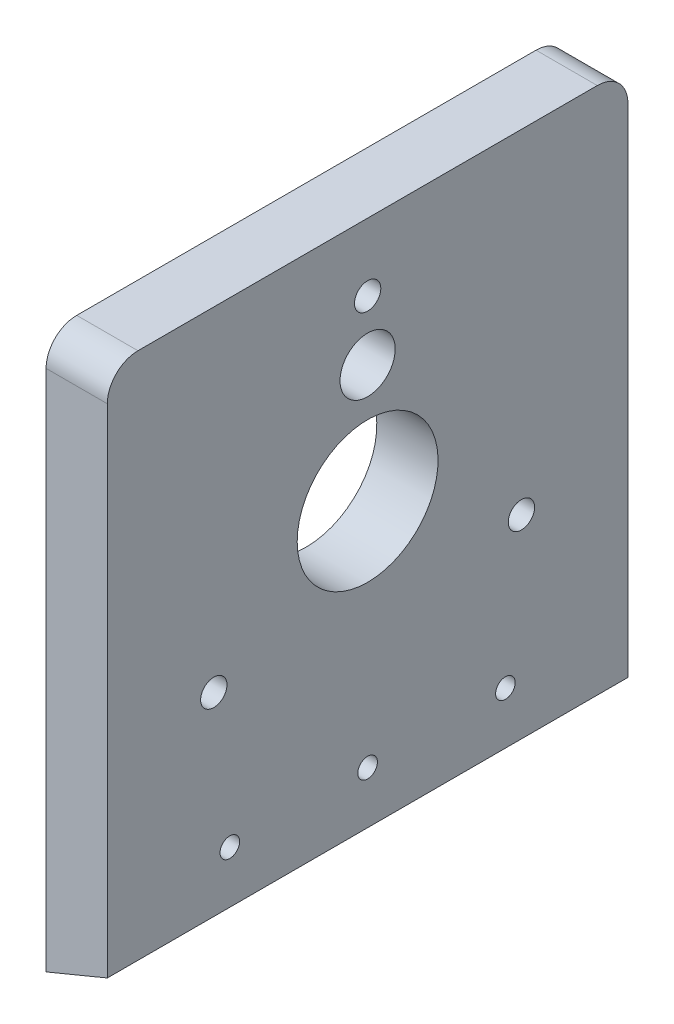
ISO-10303-21;
HEADER;
FILE_DESCRIPTION(('STEP AP214'),'2;1');
FILE_NAME('part.step','',(''),(''),'','','');
FILE_SCHEMA(('AUTOMOTIVE_DESIGN { 1 0 10303 214 1 1 1 1 }'));
ENDSEC;
DATA;
#1=APPLICATION_CONTEXT('core data for automotive mechanical design processes');
#2=APPLICATION_PROTOCOL_DEFINITION('international standard','automotive_design',2000,#1);
#3=PRODUCT_CONTEXT('',#1,'mechanical');
#4=PRODUCT('Part','Part','',(#3));
#5=PRODUCT_RELATED_PRODUCT_CATEGORY('part','',(#4));
#6=PRODUCT_DEFINITION_FORMATION('','',#4);
#7=PRODUCT_DEFINITION_CONTEXT('part definition',#1,'design');
#8=PRODUCT_DEFINITION('design','',#6,#7);
#9=PRODUCT_DEFINITION_SHAPE('','',#8);
#10=(LENGTH_UNIT() NAMED_UNIT(*) SI_UNIT(.MILLI.,.METRE.));
#11=(NAMED_UNIT(*) PLANE_ANGLE_UNIT() SI_UNIT($,.RADIAN.));
#12=(NAMED_UNIT(*) SI_UNIT($,.STERADIAN.) SOLID_ANGLE_UNIT());
#13=UNCERTAINTY_MEASURE_WITH_UNIT(LENGTH_MEASURE(1.E-05),#10,'distance_accuracy_value','');
#14=(GEOMETRIC_REPRESENTATION_CONTEXT(3) GLOBAL_UNCERTAINTY_ASSIGNED_CONTEXT((#13)) GLOBAL_UNIT_ASSIGNED_CONTEXT((#10,
#11,#12)) REPRESENTATION_CONTEXT('',''));
#15=CARTESIAN_POINT('',(0.,0.,0.));
#16=DIRECTION('',(0.,0.,1.));
#17=DIRECTION('',(1.,0.,0.));
#18=AXIS2_PLACEMENT_3D('',#15,#16,#17);
#19=CARTESIAN_POINT('',(-9.99999999999999,-4.14213562373092,85.));
#20=DIRECTION('',(-0.382683432365088,0.923879532511288,0.));
#21=DIRECTION('',(-0.923879532511288,-0.382683432365088,0.));
#22=AXIS2_PLACEMENT_3D('',#19,#20,#21);
#23=PLANE('',#22);
#24=DIRECTION('',(0.923879532511288,0.382683432365088,0.));
#25=VECTOR('',#24,1.);
#26=CARTESIAN_POINT('',(-9.99999999999999,-4.14213562373092,0.));
#27=LINE('',#26,#25);
#28=CARTESIAN_POINT('',(-9.99999999999999,-4.14213562373092,0.));
#29=VERTEX_POINT('',#28);
#30=CARTESIAN_POINT('',(0.,0.,0.));
#31=VERTEX_POINT('',#30);
#32=EDGE_CURVE('E120',#29,#31,#27,.T.);
#33=ORIENTED_EDGE('',*,*,#32,.T.);
#34=DIRECTION('',(0.,0.,-1.));
#35=VECTOR('',#34,1.);
#36=CARTESIAN_POINT('',(0.,0.,85.));
#37=LINE('',#36,#35);
#38=CARTESIAN_POINT('',(0.,0.,85.));
#39=VERTEX_POINT('',#38);
#40=EDGE_CURVE('E102',#39,#31,#37,.T.);
#41=ORIENTED_EDGE('',*,*,#40,.F.);
#42=DIRECTION('',(0.923879532511288,0.382683432365088,0.));
#43=VECTOR('',#42,1.);
#44=CARTESIAN_POINT('',(-9.99999999999999,-4.14213562373092,85.));
#45=LINE('',#44,#43);
#46=CARTESIAN_POINT('',(-9.99999999999999,-4.14213562373092,85.));
#47=VERTEX_POINT('',#46);
#48=EDGE_CURVE('E108',#47,#39,#45,.T.);
#49=ORIENTED_EDGE('',*,*,#48,.F.);
#50=DIRECTION('',(0.,0.,-1.));
#51=VECTOR('',#50,1.);
#52=CARTESIAN_POINT('',(-9.99999999999999,-4.14213562373092,85.));
#53=LINE('',#52,#51);
#54=EDGE_CURVE('E180',#47,#29,#53,.T.);
#55=ORIENTED_EDGE('',*,*,#54,.T.);
#56=EDGE_LOOP('',(#33,#41,#49,#55));
#57=FACE_BOUND('',#56,.T.);
#58=ADVANCED_FACE('F44',(#57),#23,.F.);
#59=CARTESIAN_POINT('',(0.,0.,85.));
#60=DIRECTION('',(-1.,0.,0.));
#61=DIRECTION('',(0.,0.,1.));
#62=AXIS2_PLACEMENT_3D('',#59,#60,#61);
#63=PLANE('',#62);
#64=CARTESIAN_POINT('',(0.,8.5,65.));
#65=DIRECTION('',(1.,0.,0.));
#66=DIRECTION('',(0.,0.,-1.));
#67=AXIS2_PLACEMENT_3D('',#64,#65,#66);
#68=CIRCLE('',#67,1.6);
#69=CARTESIAN_POINT('',(0.,8.5,63.4));
#70=VERTEX_POINT('',#69);
#71=EDGE_CURVE('E139',#70,#70,#68,.T.);
#72=ORIENTED_EDGE('',*,*,#71,.F.);
#73=EDGE_LOOP('',(#72));
#74=FACE_BOUND('',#73,.T.);
#75=CARTESIAN_POINT('',(0.,8.5,20.));
#76=DIRECTION('',(1.,0.,0.));
#77=DIRECTION('',(0.,0.,-1.));
#78=AXIS2_PLACEMENT_3D('',#75,#76,#77);
#79=CIRCLE('',#78,1.6);
#80=CARTESIAN_POINT('',(0.,8.5,18.4));
#81=VERTEX_POINT('',#80);
#82=EDGE_CURVE('E232',#81,#81,#79,.T.);
#83=ORIENTED_EDGE('',*,*,#82,.F.);
#84=EDGE_LOOP('',(#83));
#85=FACE_BOUND('',#84,.T.);
#86=CARTESIAN_POINT('',(0.,8.5,42.5));
#87=DIRECTION('',(1.,0.,0.));
#88=DIRECTION('',(0.,0.,-1.));
#89=AXIS2_PLACEMENT_3D('',#86,#87,#88);
#90=CIRCLE('',#89,1.6);
#91=CARTESIAN_POINT('',(0.,8.5,40.9));
#92=VERTEX_POINT('',#91);
#93=EDGE_CURVE('E228',#92,#92,#90,.T.);
#94=ORIENTED_EDGE('',*,*,#93,.F.);
#95=EDGE_LOOP('',(#94));
#96=FACE_BOUND('',#95,.T.);
#97=CARTESIAN_POINT('',(0.,31.6999999999995,17.3852632902524));
#98=DIRECTION('',(-1.,0.,0.));
#99=DIRECTION('',(0.,0.,1.));
#100=AXIS2_PLACEMENT_3D('',#97,#98,#99);
#101=CIRCLE('',#100,2.15000000000001);
#102=CARTESIAN_POINT('',(0.,31.6999999999995,19.5352632902524));
#103=VERTEX_POINT('',#102);
#104=EDGE_CURVE('E186',#103,#103,#101,.T.);
#105=ORIENTED_EDGE('',*,*,#104,.T.);
#106=EDGE_LOOP('',(#105));
#107=FACE_BOUND('',#106,.T.);
#108=CARTESIAN_POINT('',(0.,31.7000000000006,67.6147367097499));
#109=DIRECTION('',(-1.,0.,0.));
#110=DIRECTION('',(0.,0.,1.));
#111=AXIS2_PLACEMENT_3D('',#108,#109,#110);
#112=CIRCLE('',#111,2.15);
#113=CARTESIAN_POINT('',(0.,31.7000000000006,69.7647367097499));
#114=VERTEX_POINT('',#113);
#115=EDGE_CURVE('E189',#114,#114,#112,.T.);
#116=ORIENTED_EDGE('',*,*,#115,.T.);
#117=EDGE_LOOP('',(#116));
#118=FACE_BOUND('',#117,.T.);
#119=CARTESIAN_POINT('',(0.,75.2,42.5));
#120=DIRECTION('',(-1.,0.,0.));
#121=DIRECTION('',(0.,0.,1.));
#122=AXIS2_PLACEMENT_3D('',#119,#120,#121);
#123=CIRCLE('',#122,2.15);
#124=CARTESIAN_POINT('',(0.,75.2,44.65));
#125=VERTEX_POINT('',#124);
#126=EDGE_CURVE('E195',#125,#125,#123,.T.);
#127=ORIENTED_EDGE('',*,*,#126,.T.);
#128=EDGE_LOOP('',(#127));
#129=FACE_BOUND('',#128,.T.);
#130=CARTESIAN_POINT('',(0.,65.45,42.5));
#131=DIRECTION('',(-1.,0.,0.));
#132=DIRECTION('',(0.,0.,1.));
#133=AXIS2_PLACEMENT_3D('',#130,#131,#132);
#134=CIRCLE('',#133,4.5);
#135=CARTESIAN_POINT('',(0.,65.45,47.));
#136=VERTEX_POINT('',#135);
#137=EDGE_CURVE('E201',#136,#136,#134,.T.);
#138=ORIENTED_EDGE('',*,*,#137,.T.);
#139=EDGE_LOOP('',(#138));
#140=FACE_BOUND('',#139,.T.);
#141=CARTESIAN_POINT('',(0.,46.2,42.5));
#142=DIRECTION('',(-1.,0.,0.));
#143=DIRECTION('',(0.,0.,1.));
#144=AXIS2_PLACEMENT_3D('',#141,#142,#143);
#145=CIRCLE('',#144,11.5);
#146=CARTESIAN_POINT('',(0.,46.2,54.));
#147=VERTEX_POINT('',#146);
#148=EDGE_CURVE('E205',#147,#147,#145,.T.);
#149=ORIENTED_EDGE('',*,*,#148,.T.);
#150=EDGE_LOOP('',(#149));
#151=FACE_BOUND('',#150,.T.);
#152=DIRECTION('',(0.,1.,0.));
#153=VECTOR('',#152,1.);
#154=CARTESIAN_POINT('',(0.,0.,0.));
#155=LINE('',#154,#153);
#156=CARTESIAN_POINT('',(0.,81.2,0.));
#157=VERTEX_POINT('',#156);
#158=EDGE_CURVE('E162',#31,#157,#155,.T.);
#159=ORIENTED_EDGE('',*,*,#158,.T.);
#160=CARTESIAN_POINT('',(0.,81.2,5.));
#161=DIRECTION('',(-1.,0.,0.));
#162=DIRECTION('',(0.,0.,1.));
#163=AXIS2_PLACEMENT_3D('',#160,#161,#162);
#164=CIRCLE('',#163,5.);
#165=CARTESIAN_POINT('',(0.,86.2,5.));
#166=VERTEX_POINT('',#165);
#167=EDGE_CURVE('E53',#157,#166,#164,.F.);
#168=ORIENTED_EDGE('',*,*,#167,.T.);
#169=DIRECTION('',(0.,0.,-1.));
#170=VECTOR('',#169,1.);
#171=CARTESIAN_POINT('',(0.,86.2,85.));
#172=LINE('',#171,#170);
#173=CARTESIAN_POINT('',(0.,86.2,80.));
#174=VERTEX_POINT('',#173);
#175=EDGE_CURVE('E123',#174,#166,#172,.T.);
#176=ORIENTED_EDGE('',*,*,#175,.F.);
#177=CARTESIAN_POINT('',(0.,81.2,80.));
#178=DIRECTION('',(-1.,0.,0.));
#179=DIRECTION('',(0.,0.,1.));
#180=AXIS2_PLACEMENT_3D('',#177,#178,#179);
#181=CIRCLE('',#180,5.);
#182=CARTESIAN_POINT('',(0.,81.2,85.));
#183=VERTEX_POINT('',#182);
#184=EDGE_CURVE('E60',#174,#183,#181,.F.);
#185=ORIENTED_EDGE('',*,*,#184,.T.);
#186=DIRECTION('',(0.,1.,0.));
#187=VECTOR('',#186,1.);
#188=CARTESIAN_POINT('',(0.,0.,85.));
#189=LINE('',#188,#187);
#190=EDGE_CURVE('E98',#39,#183,#189,.T.);
#191=ORIENTED_EDGE('',*,*,#190,.F.);
#192=ORIENTED_EDGE('',*,*,#40,.T.);
#193=EDGE_LOOP('',(#159,#168,#176,#185,#191,#192));
#194=FACE_BOUND('',#193,.T.);
#195=ADVANCED_FACE('F100',(#74,#85,#96,#107,#118,#129,#140,#151,#194),#63,.F.);
#196=CARTESIAN_POINT('',(0.,86.2,85.));
#197=DIRECTION('',(0.,-1.,0.));
#198=DIRECTION('',(0.,0.,-1.));
#199=AXIS2_PLACEMENT_3D('',#196,#197,#198);
#200=PLANE('',#199);
#201=ORIENTED_EDGE('',*,*,#175,.T.);
#202=DIRECTION('',(-1.,0.,0.));
#203=VECTOR('',#202,1.);
#204=CARTESIAN_POINT('',(0.,86.2,5.));
#205=LINE('',#204,#203);
#206=CARTESIAN_POINT('',(-10.,86.2,5.));
#207=VERTEX_POINT('',#206);
#208=EDGE_CURVE('E127',#166,#207,#205,.T.);
#209=ORIENTED_EDGE('',*,*,#208,.T.);
#210=DIRECTION('',(0.,0.,-1.));
#211=VECTOR('',#210,1.);
#212=CARTESIAN_POINT('',(-10.,86.2,85.));
#213=LINE('',#212,#211);
#214=CARTESIAN_POINT('',(-10.,86.2,80.));
#215=VERTEX_POINT('',#214);
#216=EDGE_CURVE('E130',#215,#207,#213,.T.);
#217=ORIENTED_EDGE('',*,*,#216,.F.);
#218=DIRECTION('',(-1.,0.,0.));
#219=VECTOR('',#218,1.);
#220=CARTESIAN_POINT('',(0.,86.2,80.));
#221=LINE('',#220,#219);
#222=EDGE_CURVE('E122',#215,#174,#221,.F.);
#223=ORIENTED_EDGE('',*,*,#222,.T.);
#224=EDGE_LOOP('',(#201,#209,#217,#223));
#225=FACE_BOUND('',#224,.T.);
#226=ADVANCED_FACE('F166',(#225),#200,.F.);
#227=CARTESIAN_POINT('',(-10.,86.2,85.));
#228=DIRECTION('',(1.,0.,0.));
#229=DIRECTION('',(0.,1.,0.));
#230=AXIS2_PLACEMENT_3D('',#227,#228,#229);
#231=PLANE('',#230);
#232=CARTESIAN_POINT('',(-9.99999999999998,8.5,65.));
#233=DIRECTION('',(1.,0.,0.));
#234=DIRECTION('',(0.,1.,0.));
#235=AXIS2_PLACEMENT_3D('',#232,#233,#234);
#236=CIRCLE('',#235,1.6);
#237=CARTESIAN_POINT('',(-9.99999999999998,10.1,65.));
#238=VERTEX_POINT('',#237);
#239=EDGE_CURVE('E143',#238,#238,#236,.T.);
#240=ORIENTED_EDGE('',*,*,#239,.T.);
#241=EDGE_LOOP('',(#240));
#242=FACE_BOUND('',#241,.T.);
#243=CARTESIAN_POINT('',(-9.99999999999998,8.5,20.));
#244=DIRECTION('',(1.,0.,0.));
#245=DIRECTION('',(0.,1.,0.));
#246=AXIS2_PLACEMENT_3D('',#243,#244,#245);
#247=CIRCLE('',#246,1.6);
#248=CARTESIAN_POINT('',(-9.99999999999998,10.1,20.));
#249=VERTEX_POINT('',#248);
#250=EDGE_CURVE('E138',#249,#249,#247,.T.);
#251=ORIENTED_EDGE('',*,*,#250,.T.);
#252=EDGE_LOOP('',(#251));
#253=FACE_BOUND('',#252,.T.);
#254=CARTESIAN_POINT('',(-9.99999999999998,8.5,42.5));
#255=DIRECTION('',(1.,0.,0.));
#256=DIRECTION('',(0.,1.,0.));
#257=AXIS2_PLACEMENT_3D('',#254,#255,#256);
#258=CIRCLE('',#257,1.6);
#259=CARTESIAN_POINT('',(-9.99999999999998,10.1,42.5));
#260=VERTEX_POINT('',#259);
#261=EDGE_CURVE('E134',#260,#260,#258,.T.);
#262=ORIENTED_EDGE('',*,*,#261,.T.);
#263=EDGE_LOOP('',(#262));
#264=FACE_BOUND('',#263,.T.);
#265=CARTESIAN_POINT('',(-9.99999999999999,31.6999999999995,17.3852632902524));
#266=DIRECTION('',(-1.,0.,0.));
#267=DIRECTION('',(0.,-1.,0.));
#268=AXIS2_PLACEMENT_3D('',#265,#266,#267);
#269=CIRCLE('',#268,2.15000000000001);
#270=CARTESIAN_POINT('',(-9.99999999999999,29.5499999999995,17.3852632902524));
#271=VERTEX_POINT('',#270);
#272=EDGE_CURVE('E146',#271,#271,#269,.T.);
#273=ORIENTED_EDGE('',*,*,#272,.F.);
#274=EDGE_LOOP('',(#273));
#275=FACE_BOUND('',#274,.T.);
#276=CARTESIAN_POINT('',(-9.99999999999999,31.7000000000006,67.6147367097499));
#277=DIRECTION('',(-1.,0.,0.));
#278=DIRECTION('',(0.,-1.,0.));
#279=AXIS2_PLACEMENT_3D('',#276,#277,#278);
#280=CIRCLE('',#279,2.15);
#281=CARTESIAN_POINT('',(-9.99999999999999,29.5500000000006,67.6147367097499));
#282=VERTEX_POINT('',#281);
#283=EDGE_CURVE('E217',#282,#282,#280,.T.);
#284=ORIENTED_EDGE('',*,*,#283,.F.);
#285=EDGE_LOOP('',(#284));
#286=FACE_BOUND('',#285,.T.);
#287=CARTESIAN_POINT('',(-10.,75.2,42.5));
#288=DIRECTION('',(-1.,0.,0.));
#289=DIRECTION('',(0.,-1.,0.));
#290=AXIS2_PLACEMENT_3D('',#287,#288,#289);
#291=CIRCLE('',#290,2.15);
#292=CARTESIAN_POINT('',(-10.,73.05,42.5));
#293=VERTEX_POINT('',#292);
#294=EDGE_CURVE('E221',#293,#293,#291,.T.);
#295=ORIENTED_EDGE('',*,*,#294,.F.);
#296=EDGE_LOOP('',(#295));
#297=FACE_BOUND('',#296,.T.);
#298=CARTESIAN_POINT('',(-10.,65.45,42.5));
#299=DIRECTION('',(-1.,0.,0.));
#300=DIRECTION('',(0.,-1.,0.));
#301=AXIS2_PLACEMENT_3D('',#298,#299,#300);
#302=CIRCLE('',#301,4.5);
#303=CARTESIAN_POINT('',(-10.,60.95,42.5));
#304=VERTEX_POINT('',#303);
#305=EDGE_CURVE('E213',#304,#304,#302,.T.);
#306=ORIENTED_EDGE('',*,*,#305,.F.);
#307=EDGE_LOOP('',(#306));
#308=FACE_BOUND('',#307,.T.);
#309=CARTESIAN_POINT('',(-9.99999999999999,46.2,42.5));
#310=DIRECTION('',(-1.,0.,0.));
#311=DIRECTION('',(0.,-1.,0.));
#312=AXIS2_PLACEMENT_3D('',#309,#310,#311);
#313=CIRCLE('',#312,11.5);
#314=CARTESIAN_POINT('',(-9.99999999999999,34.7,42.5));
#315=VERTEX_POINT('',#314);
#316=EDGE_CURVE('E209',#315,#315,#313,.T.);
#317=ORIENTED_EDGE('',*,*,#316,.F.);
#318=EDGE_LOOP('',(#317));
#319=FACE_BOUND('',#318,.T.);
#320=ORIENTED_EDGE('',*,*,#216,.T.);
#321=CARTESIAN_POINT('',(-10.,81.2,5.));
#322=DIRECTION('',(1.,0.,0.));
#323=DIRECTION('',(0.,1.,0.));
#324=AXIS2_PLACEMENT_3D('',#321,#322,#323);
#325=CIRCLE('',#324,5.);
#326=CARTESIAN_POINT('',(-10.,81.2,0.));
#327=VERTEX_POINT('',#326);
#328=EDGE_CURVE('E154',#207,#327,#325,.F.);
#329=ORIENTED_EDGE('',*,*,#328,.T.);
#330=DIRECTION('',(0.,-1.,0.));
#331=VECTOR('',#330,1.);
#332=CARTESIAN_POINT('',(-10.,86.2,0.));
#333=LINE('',#332,#331);
#334=EDGE_CURVE('E117',#327,#29,#333,.T.);
#335=ORIENTED_EDGE('',*,*,#334,.T.);
#336=ORIENTED_EDGE('',*,*,#54,.F.);
#337=DIRECTION('',(0.,-1.,0.));
#338=VECTOR('',#337,1.);
#339=CARTESIAN_POINT('',(-10.,86.2,85.));
#340=LINE('',#339,#338);
#341=CARTESIAN_POINT('',(-10.,81.2,85.));
#342=VERTEX_POINT('',#341);
#343=EDGE_CURVE('E107',#342,#47,#340,.T.);
#344=ORIENTED_EDGE('',*,*,#343,.F.);
#345=CARTESIAN_POINT('',(-10.,81.2,80.));
#346=DIRECTION('',(1.,0.,0.));
#347=DIRECTION('',(0.,1.,0.));
#348=AXIS2_PLACEMENT_3D('',#345,#346,#347);
#349=CIRCLE('',#348,5.);
#350=EDGE_CURVE('E151',#342,#215,#349,.F.);
#351=ORIENTED_EDGE('',*,*,#350,.T.);
#352=EDGE_LOOP('',(#320,#329,#335,#336,#344,#351));
#353=FACE_BOUND('',#352,.T.);
#354=ADVANCED_FACE('F172',(#242,#253,#264,#275,#286,#297,#308,#319,#353),#231,.F.);
#355=CARTESIAN_POINT('',(0.,0.,85.));
#356=DIRECTION('',(0.,0.,1.));
#357=DIRECTION('',(1.,0.,0.));
#358=AXIS2_PLACEMENT_3D('',#355,#356,#357);
#359=PLANE('',#358);
#360=ORIENTED_EDGE('',*,*,#190,.T.);
#361=DIRECTION('',(-1.,0.,0.));
#362=VECTOR('',#361,1.);
#363=CARTESIAN_POINT('',(-10.,81.2,85.));
#364=LINE('',#363,#362);
#365=EDGE_CURVE('E11',#183,#342,#364,.T.);
#366=ORIENTED_EDGE('',*,*,#365,.T.);
#367=ORIENTED_EDGE('',*,*,#343,.T.);
#368=ORIENTED_EDGE('',*,*,#48,.T.);
#369=EDGE_LOOP('',(#360,#366,#367,#368));
#370=FACE_BOUND('',#369,.T.);
#371=ADVANCED_FACE('F111',(#370),#359,.T.);
#372=CARTESIAN_POINT('',(0.,0.,0.));
#373=DIRECTION('',(0.,0.,1.));
#374=DIRECTION('',(1.,0.,0.));
#375=AXIS2_PLACEMENT_3D('',#372,#373,#374);
#376=PLANE('',#375);
#377=ORIENTED_EDGE('',*,*,#334,.F.);
#378=DIRECTION('',(-1.,0.,0.));
#379=VECTOR('',#378,1.);
#380=CARTESIAN_POINT('',(0.,81.2,0.));
#381=LINE('',#380,#379);
#382=EDGE_CURVE('E68',#327,#157,#381,.F.);
#383=ORIENTED_EDGE('',*,*,#382,.T.);
#384=ORIENTED_EDGE('',*,*,#158,.F.);
#385=ORIENTED_EDGE('',*,*,#32,.F.);
#386=EDGE_LOOP('',(#377,#383,#384,#385));
#387=FACE_BOUND('',#386,.T.);
#388=ADVANCED_FACE('F173',(#387),#376,.F.);
#389=CARTESIAN_POINT('',(75.,46.2,42.5));
#390=DIRECTION('',(-1.,0.,0.));
#391=DIRECTION('',(0.,-1.,0.));
#392=AXIS2_PLACEMENT_3D('',#389,#390,#391);
#393=CYLINDRICAL_SURFACE('',#392,11.5);
#394=ORIENTED_EDGE('',*,*,#316,.T.);
#395=EDGE_LOOP('',(#394));
#396=FACE_BOUND('',#395,.T.);
#397=ORIENTED_EDGE('',*,*,#148,.F.);
#398=EDGE_LOOP('',(#397));
#399=FACE_BOUND('',#398,.T.);
#400=ADVANCED_FACE('F258',(#396,#399),#393,.F.);
#401=CARTESIAN_POINT('',(75.,65.45,42.5));
#402=DIRECTION('',(-1.,0.,0.));
#403=DIRECTION('',(0.,-1.,0.));
#404=AXIS2_PLACEMENT_3D('',#401,#402,#403);
#405=CYLINDRICAL_SURFACE('',#404,4.5);
#406=ORIENTED_EDGE('',*,*,#305,.T.);
#407=EDGE_LOOP('',(#406));
#408=FACE_BOUND('',#407,.T.);
#409=ORIENTED_EDGE('',*,*,#137,.F.);
#410=EDGE_LOOP('',(#409));
#411=FACE_BOUND('',#410,.T.);
#412=ADVANCED_FACE('F260',(#408,#411),#405,.F.);
#413=CARTESIAN_POINT('',(75.,75.2,42.5));
#414=DIRECTION('',(-1.,0.,0.));
#415=DIRECTION('',(0.,-1.,0.));
#416=AXIS2_PLACEMENT_3D('',#413,#414,#415);
#417=CYLINDRICAL_SURFACE('',#416,2.15);
#418=ORIENTED_EDGE('',*,*,#294,.T.);
#419=EDGE_LOOP('',(#418));
#420=FACE_BOUND('',#419,.T.);
#421=ORIENTED_EDGE('',*,*,#126,.F.);
#422=EDGE_LOOP('',(#421));
#423=FACE_BOUND('',#422,.T.);
#424=ADVANCED_FACE('F267',(#420,#423),#417,.F.);
#425=CARTESIAN_POINT('',(75.,31.7000000000006,67.6147367097499));
#426=DIRECTION('',(-1.,0.,0.));
#427=DIRECTION('',(0.,-1.,0.));
#428=AXIS2_PLACEMENT_3D('',#425,#426,#427);
#429=CYLINDRICAL_SURFACE('',#428,2.15);
#430=ORIENTED_EDGE('',*,*,#283,.T.);
#431=EDGE_LOOP('',(#430));
#432=FACE_BOUND('',#431,.T.);
#433=ORIENTED_EDGE('',*,*,#115,.F.);
#434=EDGE_LOOP('',(#433));
#435=FACE_BOUND('',#434,.T.);
#436=ADVANCED_FACE('F299',(#432,#435),#429,.F.);
#437=CARTESIAN_POINT('',(75.,31.6999999999995,17.3852632902524));
#438=DIRECTION('',(-1.,0.,0.));
#439=DIRECTION('',(0.,-1.,0.));
#440=AXIS2_PLACEMENT_3D('',#437,#438,#439);
#441=CYLINDRICAL_SURFACE('',#440,2.15000000000001);
#442=ORIENTED_EDGE('',*,*,#272,.T.);
#443=EDGE_LOOP('',(#442));
#444=FACE_BOUND('',#443,.T.);
#445=ORIENTED_EDGE('',*,*,#104,.F.);
#446=EDGE_LOOP('',(#445));
#447=FACE_BOUND('',#446,.T.);
#448=ADVANCED_FACE('F294',(#444,#447),#441,.F.);
#449=CARTESIAN_POINT('',(-85.,8.5,42.5));
#450=DIRECTION('',(1.,0.,0.));
#451=DIRECTION('',(0.,0.,-1.));
#452=AXIS2_PLACEMENT_3D('',#449,#450,#451);
#453=CYLINDRICAL_SURFACE('',#452,1.6);
#454=ORIENTED_EDGE('',*,*,#93,.T.);
#455=EDGE_LOOP('',(#454));
#456=FACE_BOUND('',#455,.T.);
#457=ORIENTED_EDGE('',*,*,#261,.F.);
#458=EDGE_LOOP('',(#457));
#459=FACE_BOUND('',#458,.T.);
#460=ADVANCED_FACE('F289',(#456,#459),#453,.F.);
#461=CARTESIAN_POINT('',(-85.,8.5,20.));
#462=DIRECTION('',(1.,0.,0.));
#463=DIRECTION('',(0.,0.,-1.));
#464=AXIS2_PLACEMENT_3D('',#461,#462,#463);
#465=CYLINDRICAL_SURFACE('',#464,1.6);
#466=ORIENTED_EDGE('',*,*,#82,.T.);
#467=EDGE_LOOP('',(#466));
#468=FACE_BOUND('',#467,.T.);
#469=ORIENTED_EDGE('',*,*,#250,.F.);
#470=EDGE_LOOP('',(#469));
#471=FACE_BOUND('',#470,.T.);
#472=ADVANCED_FACE('F284',(#468,#471),#465,.F.);
#473=CARTESIAN_POINT('',(-85.,8.5,65.));
#474=DIRECTION('',(1.,0.,0.));
#475=DIRECTION('',(0.,0.,-1.));
#476=AXIS2_PLACEMENT_3D('',#473,#474,#475);
#477=CYLINDRICAL_SURFACE('',#476,1.6);
#478=ORIENTED_EDGE('',*,*,#71,.T.);
#479=EDGE_LOOP('',(#478));
#480=FACE_BOUND('',#479,.T.);
#481=ORIENTED_EDGE('',*,*,#239,.F.);
#482=EDGE_LOOP('',(#481));
#483=FACE_BOUND('',#482,.T.);
#484=ADVANCED_FACE('F240',(#480,#483),#477,.F.);
#485=CARTESIAN_POINT('',(0.,81.2,5.));
#486=DIRECTION('',(-1.,0.,0.));
#487=DIRECTION('',(0.,0.,1.));
#488=AXIS2_PLACEMENT_3D('',#485,#486,#487);
#489=CYLINDRICAL_SURFACE('',#488,5.);
#490=ORIENTED_EDGE('',*,*,#167,.F.);
#491=ORIENTED_EDGE('',*,*,#382,.F.);
#492=ORIENTED_EDGE('',*,*,#328,.F.);
#493=ORIENTED_EDGE('',*,*,#208,.F.);
#494=EDGE_LOOP('',(#490,#491,#492,#493));
#495=FACE_BOUND('',#494,.T.);
#496=ADVANCED_FACE('F170',(#495),#489,.T.);
#497=CARTESIAN_POINT('',(0.,81.2,80.));
#498=DIRECTION('',(1.,0.,0.));
#499=DIRECTION('',(0.,0.,-1.));
#500=AXIS2_PLACEMENT_3D('',#497,#498,#499);
#501=CYLINDRICAL_SURFACE('',#500,5.);
#502=ORIENTED_EDGE('',*,*,#184,.F.);
#503=ORIENTED_EDGE('',*,*,#222,.F.);
#504=ORIENTED_EDGE('',*,*,#350,.F.);
#505=ORIENTED_EDGE('',*,*,#365,.F.);
#506=EDGE_LOOP('',(#502,#503,#504,#505));
#507=FACE_BOUND('',#506,.T.);
#508=ADVANCED_FACE('F46',(#507),#501,.T.);
#509=CLOSED_SHELL('',(#58,#195,#226,#354,#371,#388,#400,#412,#424,#436,#448,#460,#472,#484,#496,#508));
#510=MANIFOLD_SOLID_BREP('B2',#509);
#511=ADVANCED_BREP_SHAPE_REPRESENTATION('',(#18,#510),#14);
#512=SHAPE_DEFINITION_REPRESENTATION(#9,#511);
ENDSEC;
END-ISO-10303-21;
